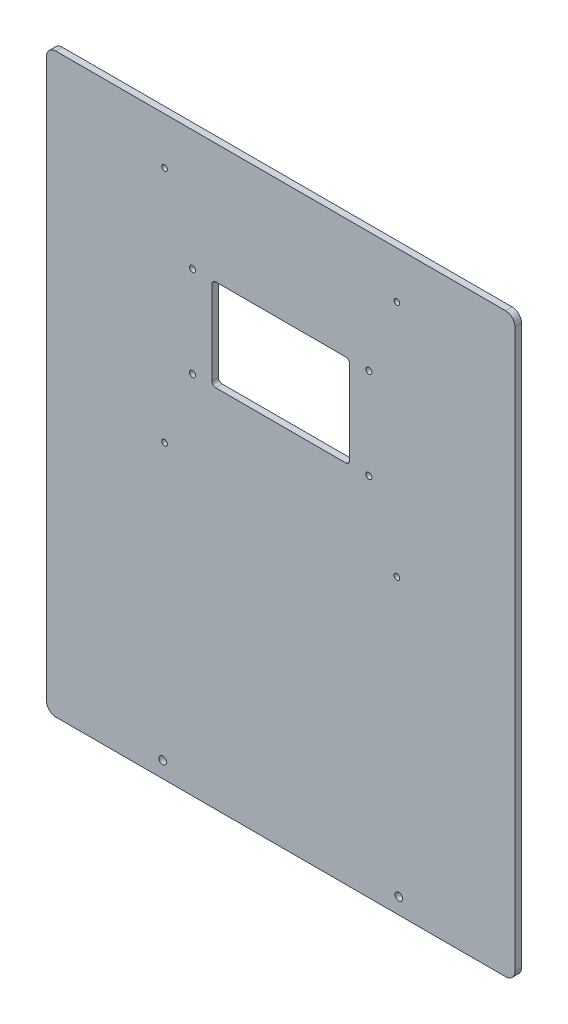
ISO-10303-21;
HEADER;
FILE_DESCRIPTION(('STEP AP214'),'2;1');
FILE_NAME('part.step','',(''),(''),'','','');
FILE_SCHEMA(('AUTOMOTIVE_DESIGN { 1 0 10303 214 1 1 1 1 }'));
ENDSEC;
DATA;
#1=APPLICATION_CONTEXT('core data for automotive mechanical design processes');
#2=APPLICATION_PROTOCOL_DEFINITION('international standard','automotive_design',2000,#1);
#3=PRODUCT_CONTEXT('',#1,'mechanical');
#4=PRODUCT('Part','Part','',(#3));
#5=PRODUCT_RELATED_PRODUCT_CATEGORY('part','',(#4));
#6=PRODUCT_DEFINITION_FORMATION('','',#4);
#7=PRODUCT_DEFINITION_CONTEXT('part definition',#1,'design');
#8=PRODUCT_DEFINITION('design','',#6,#7);
#9=PRODUCT_DEFINITION_SHAPE('','',#8);
#10=(LENGTH_UNIT() NAMED_UNIT(*) SI_UNIT(.MILLI.,.METRE.));
#11=(NAMED_UNIT(*) PLANE_ANGLE_UNIT() SI_UNIT($,.RADIAN.));
#12=(NAMED_UNIT(*) SI_UNIT($,.STERADIAN.) SOLID_ANGLE_UNIT());
#13=UNCERTAINTY_MEASURE_WITH_UNIT(LENGTH_MEASURE(1.E-05),#10,'distance_accuracy_value','');
#14=(GEOMETRIC_REPRESENTATION_CONTEXT(3) GLOBAL_UNCERTAINTY_ASSIGNED_CONTEXT((#13)) GLOBAL_UNIT_ASSIGNED_CONTEXT((#10,
#11,#12)) REPRESENTATION_CONTEXT('',''));
#15=CARTESIAN_POINT('',(0.,0.,0.));
#16=DIRECTION('',(0.,0.,1.));
#17=DIRECTION('',(1.,0.,0.));
#18=AXIS2_PLACEMENT_3D('',#15,#16,#17);
#19=CARTESIAN_POINT('',(245.,5.,3.5));
#20=DIRECTION('',(0.,0.,-1.));
#21=DIRECTION('',(-1.,0.,0.));
#22=AXIS2_PLACEMENT_3D('',#19,#20,#21);
#23=CYLINDRICAL_SURFACE('',#22,5.);
#24=CARTESIAN_POINT('',(245.,5.,0.));
#25=DIRECTION('',(0.,0.,1.));
#26=DIRECTION('',(-1.,0.,0.));
#27=AXIS2_PLACEMENT_3D('',#24,#25,#26);
#28=CIRCLE('',#27,5.);
#29=CARTESIAN_POINT('',(245.,0.,0.));
#30=VERTEX_POINT('',#29);
#31=CARTESIAN_POINT('',(250.,5.,0.));
#32=VERTEX_POINT('',#31);
#33=EDGE_CURVE('E272',#30,#32,#28,.T.);
#34=ORIENTED_EDGE('',*,*,#33,.T.);
#35=DIRECTION('',(0.,0.,-1.));
#36=VECTOR('',#35,1.);
#37=CARTESIAN_POINT('',(250.,5.,3.5));
#38=LINE('',#37,#36);
#39=CARTESIAN_POINT('',(250.,5.,3.5));
#40=VERTEX_POINT('',#39);
#41=EDGE_CURVE('E11',#40,#32,#38,.T.);
#42=ORIENTED_EDGE('',*,*,#41,.F.);
#43=CARTESIAN_POINT('',(245.,5.,3.5));
#44=DIRECTION('',(0.,0.,1.));
#45=DIRECTION('',(-1.,0.,0.));
#46=AXIS2_PLACEMENT_3D('',#43,#44,#45);
#47=CIRCLE('',#46,5.);
#48=CARTESIAN_POINT('',(245.,0.,3.5));
#49=VERTEX_POINT('',#48);
#50=EDGE_CURVE('E275',#49,#40,#47,.T.);
#51=ORIENTED_EDGE('',*,*,#50,.F.);
#52=DIRECTION('',(0.,0.,-1.));
#53=VECTOR('',#52,1.);
#54=CARTESIAN_POINT('',(245.,0.,3.5));
#55=LINE('',#54,#53);
#56=EDGE_CURVE('E293',#49,#30,#55,.T.);
#57=ORIENTED_EDGE('',*,*,#56,.T.);
#58=EDGE_LOOP('',(#34,#42,#51,#57));
#59=FACE_BOUND('',#58,.T.);
#60=ADVANCED_FACE('F34',(#59),#23,.T.);
#61=CARTESIAN_POINT('',(250.,5.,3.5));
#62=DIRECTION('',(-1.,0.,0.));
#63=DIRECTION('',(0.,0.,1.));
#64=AXIS2_PLACEMENT_3D('',#61,#62,#63);
#65=PLANE('',#64);
#66=DIRECTION('',(0.,1.,0.));
#67=VECTOR('',#66,1.);
#68=CARTESIAN_POINT('',(250.,5.,0.));
#69=LINE('',#68,#67);
#70=CARTESIAN_POINT('',(250.,302.81,0.));
#71=VERTEX_POINT('',#70);
#72=EDGE_CURVE('E296',#32,#71,#69,.T.);
#73=ORIENTED_EDGE('',*,*,#72,.T.);
#74=DIRECTION('',(0.,0.,-1.));
#75=VECTOR('',#74,1.);
#76=CARTESIAN_POINT('',(250.,302.81,3.5));
#77=LINE('',#76,#75);
#78=CARTESIAN_POINT('',(250.,302.81,3.5));
#79=VERTEX_POINT('',#78);
#80=EDGE_CURVE('E41',#79,#71,#77,.T.);
#81=ORIENTED_EDGE('',*,*,#80,.F.);
#82=DIRECTION('',(0.,1.,0.));
#83=VECTOR('',#82,1.);
#84=CARTESIAN_POINT('',(250.,5.,3.5));
#85=LINE('',#84,#83);
#86=EDGE_CURVE('E278',#40,#79,#85,.T.);
#87=ORIENTED_EDGE('',*,*,#86,.F.);
#88=ORIENTED_EDGE('',*,*,#41,.T.);
#89=EDGE_LOOP('',(#73,#81,#87,#88));
#90=FACE_BOUND('',#89,.T.);
#91=ADVANCED_FACE('F352',(#90),#65,.F.);
#92=CARTESIAN_POINT('',(245.,302.81,3.5));
#93=DIRECTION('',(0.,0.,-1.));
#94=DIRECTION('',(-1.,0.,0.));
#95=AXIS2_PLACEMENT_3D('',#92,#93,#94);
#96=CYLINDRICAL_SURFACE('',#95,5.);
#97=CARTESIAN_POINT('',(245.,302.81,0.));
#98=DIRECTION('',(0.,0.,1.));
#99=DIRECTION('',(1.,0.,0.));
#100=AXIS2_PLACEMENT_3D('',#97,#98,#99);
#101=CIRCLE('',#100,5.);
#102=CARTESIAN_POINT('',(245.,307.81,0.));
#103=VERTEX_POINT('',#102);
#104=EDGE_CURVE('E298',#71,#103,#101,.T.);
#105=ORIENTED_EDGE('',*,*,#104,.T.);
#106=DIRECTION('',(0.,0.,-1.));
#107=VECTOR('',#106,1.);
#108=CARTESIAN_POINT('',(245.,307.81,3.5));
#109=LINE('',#108,#107);
#110=CARTESIAN_POINT('',(245.,307.81,3.5));
#111=VERTEX_POINT('',#110);
#112=EDGE_CURVE('E323',#111,#103,#109,.T.);
#113=ORIENTED_EDGE('',*,*,#112,.F.);
#114=CARTESIAN_POINT('',(245.,302.81,3.5));
#115=DIRECTION('',(0.,0.,1.));
#116=DIRECTION('',(1.,0.,0.));
#117=AXIS2_PLACEMENT_3D('',#114,#115,#116);
#118=CIRCLE('',#117,5.);
#119=EDGE_CURVE('E281',#79,#111,#118,.T.);
#120=ORIENTED_EDGE('',*,*,#119,.F.);
#121=ORIENTED_EDGE('',*,*,#80,.T.);
#122=EDGE_LOOP('',(#105,#113,#120,#121));
#123=FACE_BOUND('',#122,.T.);
#124=ADVANCED_FACE('F330',(#123),#96,.T.);
#125=CARTESIAN_POINT('',(5.,307.81,3.5));
#126=DIRECTION('',(0.,-1.,0.));
#127=DIRECTION('',(0.,0.,-1.));
#128=AXIS2_PLACEMENT_3D('',#125,#126,#127);
#129=PLANE('',#128);
#130=DIRECTION('',(-1.,0.,0.));
#131=VECTOR('',#130,1.);
#132=CARTESIAN_POINT('',(5.,307.81,0.));
#133=LINE('',#132,#131);
#134=CARTESIAN_POINT('',(5.,307.81,0.));
#135=VERTEX_POINT('',#134);
#136=EDGE_CURVE('E300',#103,#135,#133,.T.);
#137=ORIENTED_EDGE('',*,*,#136,.T.);
#138=DIRECTION('',(0.,0.,-1.));
#139=VECTOR('',#138,1.);
#140=CARTESIAN_POINT('',(5.,307.81,3.5));
#141=LINE('',#140,#139);
#142=CARTESIAN_POINT('',(5.,307.81,3.5));
#143=VERTEX_POINT('',#142);
#144=EDGE_CURVE('E320',#143,#135,#141,.T.);
#145=ORIENTED_EDGE('',*,*,#144,.F.);
#146=DIRECTION('',(-1.,0.,0.));
#147=VECTOR('',#146,1.);
#148=CARTESIAN_POINT('',(5.,307.81,3.5));
#149=LINE('',#148,#147);
#150=EDGE_CURVE('E283',#111,#143,#149,.T.);
#151=ORIENTED_EDGE('',*,*,#150,.F.);
#152=ORIENTED_EDGE('',*,*,#112,.T.);
#153=EDGE_LOOP('',(#137,#145,#151,#152));
#154=FACE_BOUND('',#153,.T.);
#155=ADVANCED_FACE('F340',(#154),#129,.F.);
#156=CARTESIAN_POINT('',(5.,302.81,3.5));
#157=DIRECTION('',(0.,0.,-1.));
#158=DIRECTION('',(-1.,0.,0.));
#159=AXIS2_PLACEMENT_3D('',#156,#157,#158);
#160=CYLINDRICAL_SURFACE('',#159,5.);
#161=CARTESIAN_POINT('',(5.,302.81,0.));
#162=DIRECTION('',(0.,0.,1.));
#163=DIRECTION('',(1.,0.,0.));
#164=AXIS2_PLACEMENT_3D('',#161,#162,#163);
#165=CIRCLE('',#164,5.);
#166=CARTESIAN_POINT('',(0.,302.81,0.));
#167=VERTEX_POINT('',#166);
#168=EDGE_CURVE('E302',#135,#167,#165,.T.);
#169=ORIENTED_EDGE('',*,*,#168,.T.);
#170=DIRECTION('',(0.,0.,-1.));
#171=VECTOR('',#170,1.);
#172=CARTESIAN_POINT('',(0.,302.81,3.5));
#173=LINE('',#172,#171);
#174=CARTESIAN_POINT('',(0.,302.81,3.5));
#175=VERTEX_POINT('',#174);
#176=EDGE_CURVE('E317',#175,#167,#173,.T.);
#177=ORIENTED_EDGE('',*,*,#176,.F.);
#178=CARTESIAN_POINT('',(5.,302.81,3.5));
#179=DIRECTION('',(0.,0.,1.));
#180=DIRECTION('',(1.,0.,0.));
#181=AXIS2_PLACEMENT_3D('',#178,#179,#180);
#182=CIRCLE('',#181,5.);
#183=EDGE_CURVE('E285',#143,#175,#182,.T.);
#184=ORIENTED_EDGE('',*,*,#183,.F.);
#185=ORIENTED_EDGE('',*,*,#144,.T.);
#186=EDGE_LOOP('',(#169,#177,#184,#185));
#187=FACE_BOUND('',#186,.T.);
#188=ADVANCED_FACE('F344',(#187),#160,.T.);
#189=CARTESIAN_POINT('',(0.,5.,3.5));
#190=DIRECTION('',(1.,0.,0.));
#191=DIRECTION('',(0.,0.,-1.));
#192=AXIS2_PLACEMENT_3D('',#189,#190,#191);
#193=PLANE('',#192);
#194=DIRECTION('',(0.,-1.,0.));
#195=VECTOR('',#194,1.);
#196=CARTESIAN_POINT('',(0.,5.,0.));
#197=LINE('',#196,#195);
#198=CARTESIAN_POINT('',(0.,5.,0.));
#199=VERTEX_POINT('',#198);
#200=EDGE_CURVE('E304',#167,#199,#197,.T.);
#201=ORIENTED_EDGE('',*,*,#200,.T.);
#202=DIRECTION('',(0.,0.,-1.));
#203=VECTOR('',#202,1.);
#204=CARTESIAN_POINT('',(0.,5.,3.5));
#205=LINE('',#204,#203);
#206=CARTESIAN_POINT('',(0.,5.,3.5));
#207=VERTEX_POINT('',#206);
#208=EDGE_CURVE('E314',#207,#199,#205,.T.);
#209=ORIENTED_EDGE('',*,*,#208,.F.);
#210=DIRECTION('',(0.,-1.,0.));
#211=VECTOR('',#210,1.);
#212=CARTESIAN_POINT('',(0.,5.,3.5));
#213=LINE('',#212,#211);
#214=EDGE_CURVE('E287',#175,#207,#213,.T.);
#215=ORIENTED_EDGE('',*,*,#214,.F.);
#216=ORIENTED_EDGE('',*,*,#176,.T.);
#217=EDGE_LOOP('',(#201,#209,#215,#216));
#218=FACE_BOUND('',#217,.T.);
#219=ADVANCED_FACE('F365',(#218),#193,.F.);
#220=CARTESIAN_POINT('',(5.,5.,3.5));
#221=DIRECTION('',(0.,0.,-1.));
#222=DIRECTION('',(-1.,0.,0.));
#223=AXIS2_PLACEMENT_3D('',#220,#221,#222);
#224=CYLINDRICAL_SURFACE('',#223,5.);
#225=CARTESIAN_POINT('',(5.,5.,0.));
#226=DIRECTION('',(0.,0.,1.));
#227=DIRECTION('',(-1.,0.,0.));
#228=AXIS2_PLACEMENT_3D('',#225,#226,#227);
#229=CIRCLE('',#228,5.);
#230=CARTESIAN_POINT('',(5.,0.,0.));
#231=VERTEX_POINT('',#230);
#232=EDGE_CURVE('E306',#199,#231,#229,.T.);
#233=ORIENTED_EDGE('',*,*,#232,.T.);
#234=DIRECTION('',(0.,0.,-1.));
#235=VECTOR('',#234,1.);
#236=CARTESIAN_POINT('',(5.,0.,3.5));
#237=LINE('',#236,#235);
#238=CARTESIAN_POINT('',(5.,0.,3.5));
#239=VERTEX_POINT('',#238);
#240=EDGE_CURVE('E311',#239,#231,#237,.T.);
#241=ORIENTED_EDGE('',*,*,#240,.F.);
#242=CARTESIAN_POINT('',(5.,5.,3.5));
#243=DIRECTION('',(0.,0.,1.));
#244=DIRECTION('',(-1.,0.,0.));
#245=AXIS2_PLACEMENT_3D('',#242,#243,#244);
#246=CIRCLE('',#245,5.);
#247=EDGE_CURVE('E289',#207,#239,#246,.T.);
#248=ORIENTED_EDGE('',*,*,#247,.F.);
#249=ORIENTED_EDGE('',*,*,#208,.T.);
#250=EDGE_LOOP('',(#233,#241,#248,#249));
#251=FACE_BOUND('',#250,.T.);
#252=ADVANCED_FACE('F363',(#251),#224,.T.);
#253=CARTESIAN_POINT('',(5.,0.,3.5));
#254=DIRECTION('',(0.,1.,0.));
#255=DIRECTION('',(0.,0.,1.));
#256=AXIS2_PLACEMENT_3D('',#253,#254,#255);
#257=PLANE('',#256);
#258=DIRECTION('',(1.,0.,0.));
#259=VECTOR('',#258,1.);
#260=CARTESIAN_POINT('',(5.,0.,0.));
#261=LINE('',#260,#259);
#262=EDGE_CURVE('E279',#231,#30,#261,.T.);
#263=ORIENTED_EDGE('',*,*,#262,.T.);
#264=ORIENTED_EDGE('',*,*,#56,.F.);
#265=DIRECTION('',(1.,0.,0.));
#266=VECTOR('',#265,1.);
#267=CARTESIAN_POINT('',(5.,0.,3.5));
#268=LINE('',#267,#266);
#269=EDGE_CURVE('E291',#239,#49,#268,.T.);
#270=ORIENTED_EDGE('',*,*,#269,.F.);
#271=ORIENTED_EDGE('',*,*,#240,.T.);
#272=EDGE_LOOP('',(#263,#264,#270,#271));
#273=FACE_BOUND('',#272,.T.);
#274=ADVANCED_FACE('F358',(#273),#257,.F.);
#275=CARTESIAN_POINT('',(245.,5.,3.5));
#276=DIRECTION('',(0.,0.,-1.));
#277=DIRECTION('',(-1.,0.,0.));
#278=AXIS2_PLACEMENT_3D('',#275,#276,#277);
#279=PLANE('',#278);
#280=DIRECTION('',(-1.,0.,0.));
#281=VECTOR('',#280,1.);
#282=CARTESIAN_POINT('',(90.28,243.79,3.5));
#283=LINE('',#282,#281);
#284=CARTESIAN_POINT('',(159.72,243.79,3.5));
#285=VERTEX_POINT('',#284);
#286=CARTESIAN_POINT('',(90.28,243.79,3.5));
#287=VERTEX_POINT('',#286);
#288=EDGE_CURVE('E185',#285,#287,#283,.T.);
#289=ORIENTED_EDGE('',*,*,#288,.F.);
#290=CARTESIAN_POINT('',(159.72,241.79,3.5));
#291=DIRECTION('',(0.,0.,1.));
#292=DIRECTION('',(-1.,0.,0.));
#293=AXIS2_PLACEMENT_3D('',#290,#291,#292);
#294=CIRCLE('',#293,2.);
#295=CARTESIAN_POINT('',(161.72,241.79,3.5));
#296=VERTEX_POINT('',#295);
#297=EDGE_CURVE('E48',#296,#285,#294,.T.);
#298=ORIENTED_EDGE('',*,*,#297,.F.);
#299=DIRECTION('',(0.,1.,0.));
#300=VECTOR('',#299,1.);
#301=CARTESIAN_POINT('',(161.72,241.79,3.5));
#302=LINE('',#301,#300);
#303=CARTESIAN_POINT('',(161.72,196.83,3.5));
#304=VERTEX_POINT('',#303);
#305=EDGE_CURVE('E165',#304,#296,#302,.T.);
#306=ORIENTED_EDGE('',*,*,#305,.F.);
#307=CARTESIAN_POINT('',(159.72,196.83,3.5));
#308=DIRECTION('',(0.,0.,1.));
#309=DIRECTION('',(-1.,0.,0.));
#310=AXIS2_PLACEMENT_3D('',#307,#308,#309);
#311=CIRCLE('',#310,2.);
#312=CARTESIAN_POINT('',(159.72,194.83,3.5));
#313=VERTEX_POINT('',#312);
#314=EDGE_CURVE('E168',#313,#304,#311,.T.);
#315=ORIENTED_EDGE('',*,*,#314,.F.);
#316=DIRECTION('',(1.,0.,0.));
#317=VECTOR('',#316,1.);
#318=CARTESIAN_POINT('',(90.28,194.83,3.5));
#319=LINE('',#318,#317);
#320=CARTESIAN_POINT('',(90.28,194.83,3.5));
#321=VERTEX_POINT('',#320);
#322=EDGE_CURVE('E196',#321,#313,#319,.T.);
#323=ORIENTED_EDGE('',*,*,#322,.F.);
#324=CARTESIAN_POINT('',(90.28,196.83,3.5));
#325=DIRECTION('',(0.,0.,1.));
#326=DIRECTION('',(-1.,0.,0.));
#327=AXIS2_PLACEMENT_3D('',#324,#325,#326);
#328=CIRCLE('',#327,2.);
#329=CARTESIAN_POINT('',(88.28,196.83,3.5));
#330=VERTEX_POINT('',#329);
#331=EDGE_CURVE('E193',#330,#321,#328,.T.);
#332=ORIENTED_EDGE('',*,*,#331,.F.);
#333=DIRECTION('',(0.,-1.,0.));
#334=VECTOR('',#333,1.);
#335=CARTESIAN_POINT('',(88.28,241.79,3.5));
#336=LINE('',#335,#334);
#337=CARTESIAN_POINT('',(88.28,241.79,3.5));
#338=VERTEX_POINT('',#337);
#339=EDGE_CURVE('E190',#338,#330,#336,.T.);
#340=ORIENTED_EDGE('',*,*,#339,.F.);
#341=CARTESIAN_POINT('',(90.28,241.79,3.5));
#342=DIRECTION('',(0.,0.,1.));
#343=DIRECTION('',(1.,0.,0.));
#344=AXIS2_PLACEMENT_3D('',#341,#342,#343);
#345=CIRCLE('',#344,2.);
#346=EDGE_CURVE('E187',#287,#338,#345,.T.);
#347=ORIENTED_EDGE('',*,*,#346,.F.);
#348=EDGE_LOOP('',(#289,#298,#306,#315,#323,#332,#340,#347));
#349=FACE_BOUND('',#348,.T.);
#350=CARTESIAN_POINT('',(172.05,195.04,3.5));
#351=DIRECTION('',(0.,0.,1.));
#352=DIRECTION('',(1.,0.,0.));
#353=AXIS2_PLACEMENT_3D('',#350,#351,#352);
#354=CIRCLE('',#353,1.59999999999999);
#355=CARTESIAN_POINT('',(173.65,195.04,3.5));
#356=VERTEX_POINT('',#355);
#357=EDGE_CURVE('E203',#356,#356,#354,.T.);
#358=ORIENTED_EDGE('',*,*,#357,.F.);
#359=EDGE_LOOP('',(#358));
#360=FACE_BOUND('',#359,.T.);
#361=CARTESIAN_POINT('',(77.95,195.04,3.5));
#362=DIRECTION('',(0.,0.,1.));
#363=DIRECTION('',(1.,0.,0.));
#364=AXIS2_PLACEMENT_3D('',#361,#362,#363);
#365=CIRCLE('',#364,1.6);
#366=CARTESIAN_POINT('',(79.55,195.04,3.5));
#367=VERTEX_POINT('',#366);
#368=EDGE_CURVE('E231',#367,#367,#365,.T.);
#369=ORIENTED_EDGE('',*,*,#368,.F.);
#370=EDGE_LOOP('',(#369));
#371=FACE_BOUND('',#370,.T.);
#372=CARTESIAN_POINT('',(187.,155.81,3.5));
#373=DIRECTION('',(0.,0.,1.));
#374=DIRECTION('',(1.,0.,0.));
#375=AXIS2_PLACEMENT_3D('',#372,#373,#374);
#376=CIRCLE('',#375,1.50000000000002);
#377=CARTESIAN_POINT('',(188.5,155.81,3.5));
#378=VERTEX_POINT('',#377);
#379=EDGE_CURVE('E225',#378,#378,#376,.T.);
#380=ORIENTED_EDGE('',*,*,#379,.F.);
#381=EDGE_LOOP('',(#380));
#382=FACE_BOUND('',#381,.T.);
#383=CARTESIAN_POINT('',(187.,282.81,3.5));
#384=DIRECTION('',(0.,0.,1.));
#385=DIRECTION('',(1.,0.,0.));
#386=AXIS2_PLACEMENT_3D('',#383,#384,#385);
#387=CIRCLE('',#386,1.5);
#388=CARTESIAN_POINT('',(188.5,282.81,3.5));
#389=VERTEX_POINT('',#388);
#390=EDGE_CURVE('E219',#389,#389,#387,.T.);
#391=ORIENTED_EDGE('',*,*,#390,.F.);
#392=EDGE_LOOP('',(#391));
#393=FACE_BOUND('',#392,.T.);
#394=CARTESIAN_POINT('',(63.,282.81,3.5));
#395=DIRECTION('',(0.,0.,1.));
#396=DIRECTION('',(1.,0.,0.));
#397=AXIS2_PLACEMENT_3D('',#394,#395,#396);
#398=CIRCLE('',#397,1.5);
#399=CARTESIAN_POINT('',(64.5,282.81,3.5));
#400=VERTEX_POINT('',#399);
#401=EDGE_CURVE('E218',#400,#400,#398,.T.);
#402=ORIENTED_EDGE('',*,*,#401,.F.);
#403=EDGE_LOOP('',(#402));
#404=FACE_BOUND('',#403,.T.);
#405=CARTESIAN_POINT('',(63.0000000000003,155.81,3.5));
#406=DIRECTION('',(0.,0.,1.));
#407=DIRECTION('',(1.,0.,0.));
#408=AXIS2_PLACEMENT_3D('',#405,#406,#407);
#409=CIRCLE('',#408,1.5);
#410=CARTESIAN_POINT('',(64.5000000000003,155.81,3.5));
#411=VERTEX_POINT('',#410);
#412=EDGE_CURVE('E249',#411,#411,#409,.T.);
#413=ORIENTED_EDGE('',*,*,#412,.F.);
#414=EDGE_LOOP('',(#413));
#415=FACE_BOUND('',#414,.T.);
#416=CARTESIAN_POINT('',(172.05,243.58,3.5));
#417=DIRECTION('',(0.,0.,1.));
#418=DIRECTION('',(1.,0.,0.));
#419=AXIS2_PLACEMENT_3D('',#416,#417,#418);
#420=CIRCLE('',#419,1.59999999999999);
#421=CARTESIAN_POINT('',(173.65,243.58,3.5));
#422=VERTEX_POINT('',#421);
#423=EDGE_CURVE('E243',#422,#422,#420,.T.);
#424=ORIENTED_EDGE('',*,*,#423,.F.);
#425=EDGE_LOOP('',(#424));
#426=FACE_BOUND('',#425,.T.);
#427=CARTESIAN_POINT('',(77.95,243.58,3.5));
#428=DIRECTION('',(0.,0.,1.));
#429=DIRECTION('',(1.,0.,0.));
#430=AXIS2_PLACEMENT_3D('',#427,#428,#429);
#431=CIRCLE('',#430,1.6);
#432=CARTESIAN_POINT('',(79.55,243.58,3.5));
#433=VERTEX_POINT('',#432);
#434=EDGE_CURVE('E242',#433,#433,#431,.T.);
#435=ORIENTED_EDGE('',*,*,#434,.F.);
#436=EDGE_LOOP('',(#435));
#437=FACE_BOUND('',#436,.T.);
#438=CARTESIAN_POINT('',(188.,8.5,3.5));
#439=DIRECTION('',(0.,0.,1.));
#440=DIRECTION('',(1.,0.,0.));
#441=AXIS2_PLACEMENT_3D('',#438,#439,#440);
#442=CIRCLE('',#441,2.);
#443=CARTESIAN_POINT('',(190.,8.5,3.5));
#444=VERTEX_POINT('',#443);
#445=EDGE_CURVE('E260',#444,#444,#442,.T.);
#446=ORIENTED_EDGE('',*,*,#445,.F.);
#447=EDGE_LOOP('',(#446));
#448=FACE_BOUND('',#447,.T.);
#449=CARTESIAN_POINT('',(62.,8.49999999999999,3.5));
#450=DIRECTION('',(0.,0.,1.));
#451=DIRECTION('',(1.,0.,0.));
#452=AXIS2_PLACEMENT_3D('',#449,#450,#451);
#453=CIRCLE('',#452,2.);
#454=CARTESIAN_POINT('',(64.,8.49999999999999,3.5));
#455=VERTEX_POINT('',#454);
#456=EDGE_CURVE('E266',#455,#455,#453,.T.);
#457=ORIENTED_EDGE('',*,*,#456,.F.);
#458=EDGE_LOOP('',(#457));
#459=FACE_BOUND('',#458,.T.);
#460=ORIENTED_EDGE('',*,*,#50,.T.);
#461=ORIENTED_EDGE('',*,*,#86,.T.);
#462=ORIENTED_EDGE('',*,*,#119,.T.);
#463=ORIENTED_EDGE('',*,*,#150,.T.);
#464=ORIENTED_EDGE('',*,*,#183,.T.);
#465=ORIENTED_EDGE('',*,*,#214,.T.);
#466=ORIENTED_EDGE('',*,*,#247,.T.);
#467=ORIENTED_EDGE('',*,*,#269,.T.);
#468=EDGE_LOOP('',(#460,#461,#462,#463,#464,#465,#466,#467));
#469=FACE_BOUND('',#468,.T.);
#470=ADVANCED_FACE('F348',(#349,#360,#371,#382,#393,#404,#415,#426,#437,#448,#459,#469),#279,.F.);
#471=CARTESIAN_POINT('',(245.,5.,0.));
#472=DIRECTION('',(0.,0.,-1.));
#473=DIRECTION('',(-1.,0.,0.));
#474=AXIS2_PLACEMENT_3D('',#471,#472,#473);
#475=PLANE('',#474);
#476=CARTESIAN_POINT('',(159.72,241.79,0.));
#477=DIRECTION('',(0.,0.,1.));
#478=DIRECTION('',(-1.,0.,0.));
#479=AXIS2_PLACEMENT_3D('',#476,#477,#478);
#480=CIRCLE('',#479,2.);
#481=CARTESIAN_POINT('',(161.72,241.79,0.));
#482=VERTEX_POINT('',#481);
#483=CARTESIAN_POINT('',(159.72,243.79,0.));
#484=VERTEX_POINT('',#483);
#485=EDGE_CURVE('E148',#482,#484,#480,.T.);
#486=ORIENTED_EDGE('',*,*,#485,.T.);
#487=DIRECTION('',(-1.,0.,0.));
#488=VECTOR('',#487,1.);
#489=CARTESIAN_POINT('',(90.28,243.79,0.));
#490=LINE('',#489,#488);
#491=CARTESIAN_POINT('',(90.28,243.79,0.));
#492=VERTEX_POINT('',#491);
#493=EDGE_CURVE('E157',#484,#492,#490,.T.);
#494=ORIENTED_EDGE('',*,*,#493,.T.);
#495=CARTESIAN_POINT('',(90.28,241.79,0.));
#496=DIRECTION('',(0.,0.,1.));
#497=DIRECTION('',(1.,0.,0.));
#498=AXIS2_PLACEMENT_3D('',#495,#496,#497);
#499=CIRCLE('',#498,2.);
#500=CARTESIAN_POINT('',(88.28,241.79,0.));
#501=VERTEX_POINT('',#500);
#502=EDGE_CURVE('E56',#492,#501,#499,.T.);
#503=ORIENTED_EDGE('',*,*,#502,.T.);
#504=DIRECTION('',(0.,-1.,0.));
#505=VECTOR('',#504,1.);
#506=CARTESIAN_POINT('',(88.28,241.79,0.));
#507=LINE('',#506,#505);
#508=CARTESIAN_POINT('',(88.28,196.83,0.));
#509=VERTEX_POINT('',#508);
#510=EDGE_CURVE('E172',#501,#509,#507,.T.);
#511=ORIENTED_EDGE('',*,*,#510,.T.);
#512=CARTESIAN_POINT('',(90.28,196.83,0.));
#513=DIRECTION('',(0.,0.,1.));
#514=DIRECTION('',(-1.,0.,0.));
#515=AXIS2_PLACEMENT_3D('',#512,#513,#514);
#516=CIRCLE('',#515,2.);
#517=CARTESIAN_POINT('',(90.28,194.83,0.));
#518=VERTEX_POINT('',#517);
#519=EDGE_CURVE('E175',#509,#518,#516,.T.);
#520=ORIENTED_EDGE('',*,*,#519,.T.);
#521=DIRECTION('',(1.,0.,0.));
#522=VECTOR('',#521,1.);
#523=CARTESIAN_POINT('',(90.28,194.83,0.));
#524=LINE('',#523,#522);
#525=CARTESIAN_POINT('',(159.72,194.83,0.));
#526=VERTEX_POINT('',#525);
#527=EDGE_CURVE('E178',#518,#526,#524,.T.);
#528=ORIENTED_EDGE('',*,*,#527,.T.);
#529=CARTESIAN_POINT('',(159.72,196.83,0.));
#530=DIRECTION('',(0.,0.,1.));
#531=DIRECTION('',(-1.,0.,0.));
#532=AXIS2_PLACEMENT_3D('',#529,#530,#531);
#533=CIRCLE('',#532,2.);
#534=CARTESIAN_POINT('',(161.72,196.83,0.));
#535=VERTEX_POINT('',#534);
#536=EDGE_CURVE('E181',#526,#535,#533,.T.);
#537=ORIENTED_EDGE('',*,*,#536,.T.);
#538=DIRECTION('',(0.,1.,0.));
#539=VECTOR('',#538,1.);
#540=CARTESIAN_POINT('',(161.72,241.79,0.));
#541=LINE('',#540,#539);
#542=EDGE_CURVE('E154',#535,#482,#541,.T.);
#543=ORIENTED_EDGE('',*,*,#542,.T.);
#544=EDGE_LOOP('',(#486,#494,#503,#511,#520,#528,#537,#543));
#545=FACE_BOUND('',#544,.T.);
#546=CARTESIAN_POINT('',(172.05,195.04,0.));
#547=DIRECTION('',(0.,0.,1.));
#548=DIRECTION('',(1.,0.,0.));
#549=AXIS2_PLACEMENT_3D('',#546,#547,#548);
#550=CIRCLE('',#549,1.59999999999999);
#551=CARTESIAN_POINT('',(173.65,195.04,0.));
#552=VERTEX_POINT('',#551);
#553=EDGE_CURVE('E234',#552,#552,#550,.T.);
#554=ORIENTED_EDGE('',*,*,#553,.T.);
#555=EDGE_LOOP('',(#554));
#556=FACE_BOUND('',#555,.T.);
#557=CARTESIAN_POINT('',(77.95,195.04,0.));
#558=DIRECTION('',(0.,0.,1.));
#559=DIRECTION('',(1.,0.,0.));
#560=AXIS2_PLACEMENT_3D('',#557,#558,#559);
#561=CIRCLE('',#560,1.6);
#562=CARTESIAN_POINT('',(79.55,195.04,0.));
#563=VERTEX_POINT('',#562);
#564=EDGE_CURVE('E228',#563,#563,#561,.T.);
#565=ORIENTED_EDGE('',*,*,#564,.T.);
#566=EDGE_LOOP('',(#565));
#567=FACE_BOUND('',#566,.T.);
#568=CARTESIAN_POINT('',(187.,155.81,0.));
#569=DIRECTION('',(0.,0.,1.));
#570=DIRECTION('',(1.,0.,0.));
#571=AXIS2_PLACEMENT_3D('',#568,#569,#570);
#572=CIRCLE('',#571,1.50000000000002);
#573=CARTESIAN_POINT('',(188.5,155.81,0.));
#574=VERTEX_POINT('',#573);
#575=EDGE_CURVE('E222',#574,#574,#572,.T.);
#576=ORIENTED_EDGE('',*,*,#575,.T.);
#577=EDGE_LOOP('',(#576));
#578=FACE_BOUND('',#577,.T.);
#579=CARTESIAN_POINT('',(187.,282.81,0.));
#580=DIRECTION('',(0.,0.,1.));
#581=DIRECTION('',(1.,0.,0.));
#582=AXIS2_PLACEMENT_3D('',#579,#580,#581);
#583=CIRCLE('',#582,1.5);
#584=CARTESIAN_POINT('',(188.5,282.81,0.));
#585=VERTEX_POINT('',#584);
#586=EDGE_CURVE('E215',#585,#585,#583,.T.);
#587=ORIENTED_EDGE('',*,*,#586,.T.);
#588=EDGE_LOOP('',(#587));
#589=FACE_BOUND('',#588,.T.);
#590=CARTESIAN_POINT('',(63.,282.81,0.));
#591=DIRECTION('',(0.,0.,1.));
#592=DIRECTION('',(1.,0.,0.));
#593=AXIS2_PLACEMENT_3D('',#590,#591,#592);
#594=CIRCLE('',#593,1.5);
#595=CARTESIAN_POINT('',(64.5,282.81,0.));
#596=VERTEX_POINT('',#595);
#597=EDGE_CURVE('E252',#596,#596,#594,.T.);
#598=ORIENTED_EDGE('',*,*,#597,.T.);
#599=EDGE_LOOP('',(#598));
#600=FACE_BOUND('',#599,.T.);
#601=CARTESIAN_POINT('',(63.0000000000003,155.81,0.));
#602=DIRECTION('',(0.,0.,1.));
#603=DIRECTION('',(1.,0.,0.));
#604=AXIS2_PLACEMENT_3D('',#601,#602,#603);
#605=CIRCLE('',#604,1.5);
#606=CARTESIAN_POINT('',(64.5000000000003,155.81,0.));
#607=VERTEX_POINT('',#606);
#608=EDGE_CURVE('E246',#607,#607,#605,.T.);
#609=ORIENTED_EDGE('',*,*,#608,.T.);
#610=EDGE_LOOP('',(#609));
#611=FACE_BOUND('',#610,.T.);
#612=CARTESIAN_POINT('',(172.05,243.58,0.));
#613=DIRECTION('',(0.,0.,1.));
#614=DIRECTION('',(1.,0.,0.));
#615=AXIS2_PLACEMENT_3D('',#612,#613,#614);
#616=CIRCLE('',#615,1.59999999999999);
#617=CARTESIAN_POINT('',(173.65,243.58,0.));
#618=VERTEX_POINT('',#617);
#619=EDGE_CURVE('E239',#618,#618,#616,.T.);
#620=ORIENTED_EDGE('',*,*,#619,.T.);
#621=EDGE_LOOP('',(#620));
#622=FACE_BOUND('',#621,.T.);
#623=CARTESIAN_POINT('',(77.95,243.58,0.));
#624=DIRECTION('',(0.,0.,1.));
#625=DIRECTION('',(1.,0.,0.));
#626=AXIS2_PLACEMENT_3D('',#623,#624,#625);
#627=CIRCLE('',#626,1.6);
#628=CARTESIAN_POINT('',(79.55,243.58,0.));
#629=VERTEX_POINT('',#628);
#630=EDGE_CURVE('E257',#629,#629,#627,.T.);
#631=ORIENTED_EDGE('',*,*,#630,.T.);
#632=EDGE_LOOP('',(#631));
#633=FACE_BOUND('',#632,.T.);
#634=CARTESIAN_POINT('',(188.,8.5,0.));
#635=DIRECTION('',(0.,0.,1.));
#636=DIRECTION('',(1.,0.,0.));
#637=AXIS2_PLACEMENT_3D('',#634,#635,#636);
#638=CIRCLE('',#637,2.);
#639=CARTESIAN_POINT('',(190.,8.5,0.));
#640=VERTEX_POINT('',#639);
#641=EDGE_CURVE('E263',#640,#640,#638,.T.);
#642=ORIENTED_EDGE('',*,*,#641,.T.);
#643=EDGE_LOOP('',(#642));
#644=FACE_BOUND('',#643,.T.);
#645=CARTESIAN_POINT('',(62.,8.49999999999999,0.));
#646=DIRECTION('',(0.,0.,1.));
#647=DIRECTION('',(1.,0.,0.));
#648=AXIS2_PLACEMENT_3D('',#645,#646,#647);
#649=CIRCLE('',#648,2.);
#650=CARTESIAN_POINT('',(64.,8.49999999999999,0.));
#651=VERTEX_POINT('',#650);
#652=EDGE_CURVE('E269',#651,#651,#649,.T.);
#653=ORIENTED_EDGE('',*,*,#652,.T.);
#654=EDGE_LOOP('',(#653));
#655=FACE_BOUND('',#654,.T.);
#656=ORIENTED_EDGE('',*,*,#33,.F.);
#657=ORIENTED_EDGE('',*,*,#262,.F.);
#658=ORIENTED_EDGE('',*,*,#232,.F.);
#659=ORIENTED_EDGE('',*,*,#200,.F.);
#660=ORIENTED_EDGE('',*,*,#168,.F.);
#661=ORIENTED_EDGE('',*,*,#136,.F.);
#662=ORIENTED_EDGE('',*,*,#104,.F.);
#663=ORIENTED_EDGE('',*,*,#72,.F.);
#664=EDGE_LOOP('',(#656,#657,#658,#659,#660,#661,#662,#663));
#665=FACE_BOUND('',#664,.T.);
#666=ADVANCED_FACE('F161',(#545,#556,#567,#578,#589,#600,#611,#622,#633,#644,#655,#665),#475,.T.);
#667=CARTESIAN_POINT('',(62.,8.49999999999999,0.));
#668=DIRECTION('',(0.,0.,1.));
#669=DIRECTION('',(1.,0.,0.));
#670=AXIS2_PLACEMENT_3D('',#667,#668,#669);
#671=CYLINDRICAL_SURFACE('',#670,2.);
#672=ORIENTED_EDGE('',*,*,#652,.F.);
#673=EDGE_LOOP('',(#672));
#674=FACE_BOUND('',#673,.T.);
#675=ORIENTED_EDGE('',*,*,#456,.T.);
#676=EDGE_LOOP('',(#675));
#677=FACE_BOUND('',#676,.T.);
#678=ADVANCED_FACE('F417',(#674,#677),#671,.F.);
#679=CARTESIAN_POINT('',(188.,8.5,0.));
#680=DIRECTION('',(0.,0.,1.));
#681=DIRECTION('',(1.,0.,0.));
#682=AXIS2_PLACEMENT_3D('',#679,#680,#681);
#683=CYLINDRICAL_SURFACE('',#682,2.);
#684=ORIENTED_EDGE('',*,*,#641,.F.);
#685=EDGE_LOOP('',(#684));
#686=FACE_BOUND('',#685,.T.);
#687=ORIENTED_EDGE('',*,*,#445,.T.);
#688=EDGE_LOOP('',(#687));
#689=FACE_BOUND('',#688,.T.);
#690=ADVANCED_FACE('F422',(#686,#689),#683,.F.);
#691=CARTESIAN_POINT('',(77.95,243.58,0.));
#692=DIRECTION('',(0.,0.,1.));
#693=DIRECTION('',(1.,0.,0.));
#694=AXIS2_PLACEMENT_3D('',#691,#692,#693);
#695=CYLINDRICAL_SURFACE('',#694,1.6);
#696=ORIENTED_EDGE('',*,*,#630,.F.);
#697=EDGE_LOOP('',(#696));
#698=FACE_BOUND('',#697,.T.);
#699=ORIENTED_EDGE('',*,*,#434,.T.);
#700=EDGE_LOOP('',(#699));
#701=FACE_BOUND('',#700,.T.);
#702=ADVANCED_FACE('F434',(#698,#701),#695,.F.);
#703=CARTESIAN_POINT('',(172.05,243.58,0.));
#704=DIRECTION('',(0.,0.,1.));
#705=DIRECTION('',(1.,0.,0.));
#706=AXIS2_PLACEMENT_3D('',#703,#704,#705);
#707=CYLINDRICAL_SURFACE('',#706,1.59999999999999);
#708=ORIENTED_EDGE('',*,*,#619,.F.);
#709=EDGE_LOOP('',(#708));
#710=FACE_BOUND('',#709,.T.);
#711=ORIENTED_EDGE('',*,*,#423,.T.);
#712=EDGE_LOOP('',(#711));
#713=FACE_BOUND('',#712,.T.);
#714=ADVANCED_FACE('F444',(#710,#713),#707,.F.);
#715=CARTESIAN_POINT('',(63.0000000000003,155.81,0.));
#716=DIRECTION('',(0.,0.,1.));
#717=DIRECTION('',(1.,0.,0.));
#718=AXIS2_PLACEMENT_3D('',#715,#716,#717);
#719=CYLINDRICAL_SURFACE('',#718,1.5);
#720=ORIENTED_EDGE('',*,*,#608,.F.);
#721=EDGE_LOOP('',(#720));
#722=FACE_BOUND('',#721,.T.);
#723=ORIENTED_EDGE('',*,*,#412,.T.);
#724=EDGE_LOOP('',(#723));
#725=FACE_BOUND('',#724,.T.);
#726=ADVANCED_FACE('F454',(#722,#725),#719,.F.);
#727=CARTESIAN_POINT('',(63.,282.81,0.));
#728=DIRECTION('',(0.,0.,1.));
#729=DIRECTION('',(1.,0.,0.));
#730=AXIS2_PLACEMENT_3D('',#727,#728,#729);
#731=CYLINDRICAL_SURFACE('',#730,1.5);
#732=ORIENTED_EDGE('',*,*,#597,.F.);
#733=EDGE_LOOP('',(#732));
#734=FACE_BOUND('',#733,.T.);
#735=ORIENTED_EDGE('',*,*,#401,.T.);
#736=EDGE_LOOP('',(#735));
#737=FACE_BOUND('',#736,.T.);
#738=ADVANCED_FACE('F464',(#734,#737),#731,.F.);
#739=CARTESIAN_POINT('',(187.,282.81,0.));
#740=DIRECTION('',(0.,0.,1.));
#741=DIRECTION('',(1.,0.,0.));
#742=AXIS2_PLACEMENT_3D('',#739,#740,#741);
#743=CYLINDRICAL_SURFACE('',#742,1.5);
#744=ORIENTED_EDGE('',*,*,#586,.F.);
#745=EDGE_LOOP('',(#744));
#746=FACE_BOUND('',#745,.T.);
#747=ORIENTED_EDGE('',*,*,#390,.T.);
#748=EDGE_LOOP('',(#747));
#749=FACE_BOUND('',#748,.T.);
#750=ADVANCED_FACE('F474',(#746,#749),#743,.F.);
#751=CARTESIAN_POINT('',(187.,155.81,0.));
#752=DIRECTION('',(0.,0.,1.));
#753=DIRECTION('',(1.,0.,0.));
#754=AXIS2_PLACEMENT_3D('',#751,#752,#753);
#755=CYLINDRICAL_SURFACE('',#754,1.50000000000002);
#756=ORIENTED_EDGE('',*,*,#575,.F.);
#757=EDGE_LOOP('',(#756));
#758=FACE_BOUND('',#757,.T.);
#759=ORIENTED_EDGE('',*,*,#379,.T.);
#760=EDGE_LOOP('',(#759));
#761=FACE_BOUND('',#760,.T.);
#762=ADVANCED_FACE('F484',(#758,#761),#755,.F.);
#763=CARTESIAN_POINT('',(77.95,195.04,0.));
#764=DIRECTION('',(0.,0.,1.));
#765=DIRECTION('',(1.,0.,0.));
#766=AXIS2_PLACEMENT_3D('',#763,#764,#765);
#767=CYLINDRICAL_SURFACE('',#766,1.6);
#768=ORIENTED_EDGE('',*,*,#564,.F.);
#769=EDGE_LOOP('',(#768));
#770=FACE_BOUND('',#769,.T.);
#771=ORIENTED_EDGE('',*,*,#368,.T.);
#772=EDGE_LOOP('',(#771));
#773=FACE_BOUND('',#772,.T.);
#774=ADVANCED_FACE('F494',(#770,#773),#767,.F.);
#775=CARTESIAN_POINT('',(172.05,195.04,0.));
#776=DIRECTION('',(0.,0.,1.));
#777=DIRECTION('',(1.,0.,0.));
#778=AXIS2_PLACEMENT_3D('',#775,#776,#777);
#779=CYLINDRICAL_SURFACE('',#778,1.59999999999999);
#780=ORIENTED_EDGE('',*,*,#553,.F.);
#781=EDGE_LOOP('',(#780));
#782=FACE_BOUND('',#781,.T.);
#783=ORIENTED_EDGE('',*,*,#357,.T.);
#784=EDGE_LOOP('',(#783));
#785=FACE_BOUND('',#784,.T.);
#786=ADVANCED_FACE('F504',(#782,#785),#779,.F.);
#787=CARTESIAN_POINT('',(159.72,241.79,0.));
#788=DIRECTION('',(0.,0.,1.));
#789=DIRECTION('',(1.,0.,0.));
#790=AXIS2_PLACEMENT_3D('',#787,#788,#789);
#791=CYLINDRICAL_SURFACE('',#790,2.);
#792=ORIENTED_EDGE('',*,*,#297,.T.);
#793=DIRECTION('',(0.,0.,1.));
#794=VECTOR('',#793,1.);
#795=CARTESIAN_POINT('',(159.72,243.79,0.));
#796=LINE('',#795,#794);
#797=EDGE_CURVE('E144',#484,#285,#796,.T.);
#798=ORIENTED_EDGE('',*,*,#797,.F.);
#799=ORIENTED_EDGE('',*,*,#485,.F.);
#800=DIRECTION('',(0.,0.,1.));
#801=VECTOR('',#800,1.);
#802=CARTESIAN_POINT('',(161.72,241.79,0.));
#803=LINE('',#802,#801);
#804=EDGE_CURVE('E201',#482,#296,#803,.T.);
#805=ORIENTED_EDGE('',*,*,#804,.T.);
#806=EDGE_LOOP('',(#792,#798,#799,#805));
#807=FACE_BOUND('',#806,.T.);
#808=ADVANCED_FACE('F146',(#807),#791,.F.);
#809=CARTESIAN_POINT('',(161.72,241.79,0.));
#810=DIRECTION('',(1.,0.,0.));
#811=DIRECTION('',(0.,1.,0.));
#812=AXIS2_PLACEMENT_3D('',#809,#810,#811);
#813=PLANE('',#812);
#814=ORIENTED_EDGE('',*,*,#305,.T.);
#815=ORIENTED_EDGE('',*,*,#804,.F.);
#816=ORIENTED_EDGE('',*,*,#542,.F.);
#817=DIRECTION('',(0.,0.,1.));
#818=VECTOR('',#817,1.);
#819=CARTESIAN_POINT('',(161.72,196.83,0.));
#820=LINE('',#819,#818);
#821=EDGE_CURVE('E204',#535,#304,#820,.T.);
#822=ORIENTED_EDGE('',*,*,#821,.T.);
#823=EDGE_LOOP('',(#814,#815,#816,#822));
#824=FACE_BOUND('',#823,.T.);
#825=ADVANCED_FACE('F536',(#824),#813,.F.);
#826=CARTESIAN_POINT('',(159.72,196.83,0.));
#827=DIRECTION('',(0.,0.,1.));
#828=DIRECTION('',(1.,0.,0.));
#829=AXIS2_PLACEMENT_3D('',#826,#827,#828);
#830=CYLINDRICAL_SURFACE('',#829,2.);
#831=ORIENTED_EDGE('',*,*,#314,.T.);
#832=ORIENTED_EDGE('',*,*,#821,.F.);
#833=ORIENTED_EDGE('',*,*,#536,.F.);
#834=DIRECTION('',(0.,0.,1.));
#835=VECTOR('',#834,1.);
#836=CARTESIAN_POINT('',(159.72,194.83,0.));
#837=LINE('',#836,#835);
#838=EDGE_CURVE('E206',#526,#313,#837,.T.);
#839=ORIENTED_EDGE('',*,*,#838,.T.);
#840=EDGE_LOOP('',(#831,#832,#833,#839));
#841=FACE_BOUND('',#840,.T.);
#842=ADVANCED_FACE('F545',(#841),#830,.F.);
#843=CARTESIAN_POINT('',(90.28,194.83,0.));
#844=DIRECTION('',(0.,-1.,0.));
#845=DIRECTION('',(0.,0.,-1.));
#846=AXIS2_PLACEMENT_3D('',#843,#844,#845);
#847=PLANE('',#846);
#848=ORIENTED_EDGE('',*,*,#322,.T.);
#849=ORIENTED_EDGE('',*,*,#838,.F.);
#850=ORIENTED_EDGE('',*,*,#527,.F.);
#851=DIRECTION('',(0.,0.,1.));
#852=VECTOR('',#851,1.);
#853=CARTESIAN_POINT('',(90.28,194.83,0.));
#854=LINE('',#853,#852);
#855=EDGE_CURVE('E208',#518,#321,#854,.T.);
#856=ORIENTED_EDGE('',*,*,#855,.T.);
#857=EDGE_LOOP('',(#848,#849,#850,#856));
#858=FACE_BOUND('',#857,.T.);
#859=ADVANCED_FACE('F555',(#858),#847,.F.);
#860=CARTESIAN_POINT('',(90.28,196.83,0.));
#861=DIRECTION('',(0.,0.,1.));
#862=DIRECTION('',(1.,0.,0.));
#863=AXIS2_PLACEMENT_3D('',#860,#861,#862);
#864=CYLINDRICAL_SURFACE('',#863,2.);
#865=ORIENTED_EDGE('',*,*,#331,.T.);
#866=ORIENTED_EDGE('',*,*,#855,.F.);
#867=ORIENTED_EDGE('',*,*,#519,.F.);
#868=DIRECTION('',(0.,0.,1.));
#869=VECTOR('',#868,1.);
#870=CARTESIAN_POINT('',(88.28,196.83,0.));
#871=LINE('',#870,#869);
#872=EDGE_CURVE('E210',#509,#330,#871,.T.);
#873=ORIENTED_EDGE('',*,*,#872,.T.);
#874=EDGE_LOOP('',(#865,#866,#867,#873));
#875=FACE_BOUND('',#874,.T.);
#876=ADVANCED_FACE('F565',(#875),#864,.F.);
#877=CARTESIAN_POINT('',(88.28,241.79,0.));
#878=DIRECTION('',(-1.,0.,0.));
#879=DIRECTION('',(0.,0.,1.));
#880=AXIS2_PLACEMENT_3D('',#877,#878,#879);
#881=PLANE('',#880);
#882=ORIENTED_EDGE('',*,*,#339,.T.);
#883=ORIENTED_EDGE('',*,*,#872,.F.);
#884=ORIENTED_EDGE('',*,*,#510,.F.);
#885=DIRECTION('',(0.,0.,1.));
#886=VECTOR('',#885,1.);
#887=CARTESIAN_POINT('',(88.28,241.79,0.));
#888=LINE('',#887,#886);
#889=EDGE_CURVE('E212',#501,#338,#888,.T.);
#890=ORIENTED_EDGE('',*,*,#889,.T.);
#891=EDGE_LOOP('',(#882,#883,#884,#890));
#892=FACE_BOUND('',#891,.T.);
#893=ADVANCED_FACE('F575',(#892),#881,.F.);
#894=CARTESIAN_POINT('',(90.28,241.79,0.));
#895=DIRECTION('',(0.,0.,1.));
#896=DIRECTION('',(1.,0.,0.));
#897=AXIS2_PLACEMENT_3D('',#894,#895,#896);
#898=CYLINDRICAL_SURFACE('',#897,2.);
#899=ORIENTED_EDGE('',*,*,#346,.T.);
#900=ORIENTED_EDGE('',*,*,#889,.F.);
#901=ORIENTED_EDGE('',*,*,#502,.F.);
#902=DIRECTION('',(0.,0.,1.));
#903=VECTOR('',#902,1.);
#904=CARTESIAN_POINT('',(90.28,243.79,0.));
#905=LINE('',#904,#903);
#906=EDGE_CURVE('E153',#492,#287,#905,.T.);
#907=ORIENTED_EDGE('',*,*,#906,.T.);
#908=EDGE_LOOP('',(#899,#900,#901,#907));
#909=FACE_BOUND('',#908,.T.);
#910=ADVANCED_FACE('F585',(#909),#898,.F.);
#911=CARTESIAN_POINT('',(90.28,243.79,0.));
#912=DIRECTION('',(0.,1.,0.));
#913=DIRECTION('',(0.,0.,1.));
#914=AXIS2_PLACEMENT_3D('',#911,#912,#913);
#915=PLANE('',#914);
#916=ORIENTED_EDGE('',*,*,#288,.T.);
#917=ORIENTED_EDGE('',*,*,#906,.F.);
#918=ORIENTED_EDGE('',*,*,#493,.F.);
#919=ORIENTED_EDGE('',*,*,#797,.T.);
#920=EDGE_LOOP('',(#916,#917,#918,#919));
#921=FACE_BOUND('',#920,.T.);
#922=ADVANCED_FACE('F158',(#921),#915,.F.);
#923=CLOSED_SHELL('',(#60,#91,#124,#155,#188,#219,#252,#274,#470,#666,#678,#690,#702,#714,#726,
#738,#750,#762,#774,#786,#808,#825,#842,#859,#876,#893,#910,#922));
#924=MANIFOLD_SOLID_BREP('B2',#923);
#925=ADVANCED_BREP_SHAPE_REPRESENTATION('',(#18,#924),#14);
#926=SHAPE_DEFINITION_REPRESENTATION(#9,#925);
ENDSEC;
END-ISO-10303-21;
